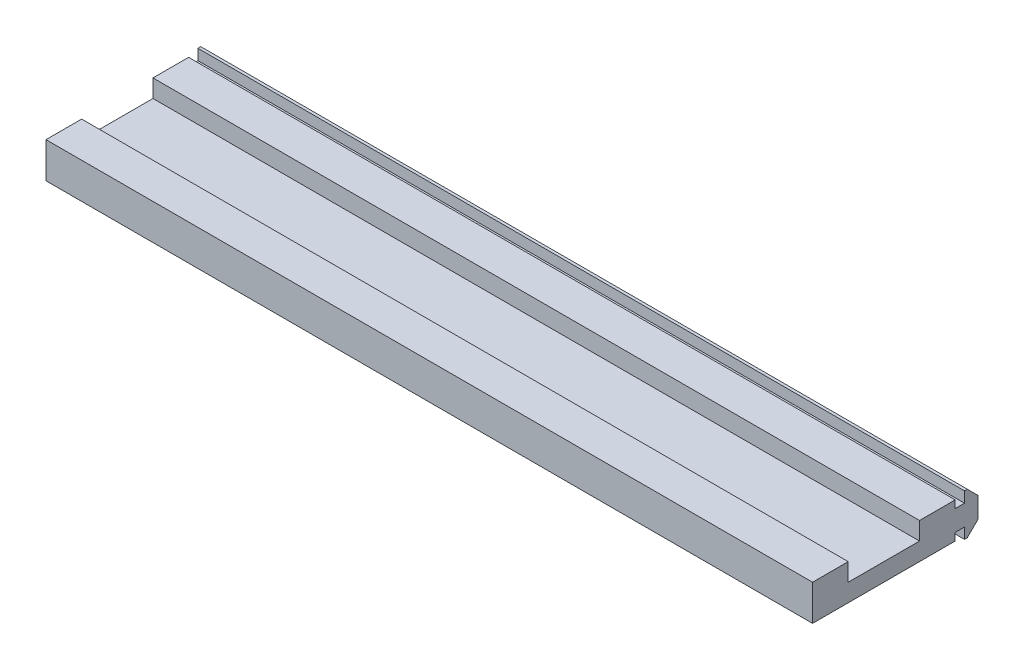
ISO-10303-21;
HEADER;
FILE_DESCRIPTION(('STEP AP214'),'2;1');
FILE_NAME('part.step','',(''),(''),'','','');
FILE_SCHEMA(('AUTOMOTIVE_DESIGN { 1 0 10303 214 1 1 1 1 }'));
ENDSEC;
DATA;
#1=APPLICATION_CONTEXT('core data for automotive mechanical design processes');
#2=APPLICATION_PROTOCOL_DEFINITION('international standard','automotive_design',2000,#1);
#3=PRODUCT_CONTEXT('',#1,'mechanical');
#4=PRODUCT('Part','Part','',(#3));
#5=PRODUCT_RELATED_PRODUCT_CATEGORY('part','',(#4));
#6=PRODUCT_DEFINITION_FORMATION('','',#4);
#7=PRODUCT_DEFINITION_CONTEXT('part definition',#1,'design');
#8=PRODUCT_DEFINITION('design','',#6,#7);
#9=PRODUCT_DEFINITION_SHAPE('','',#8);
#10=(LENGTH_UNIT() NAMED_UNIT(*) SI_UNIT(.MILLI.,.METRE.));
#11=(NAMED_UNIT(*) PLANE_ANGLE_UNIT() SI_UNIT($,.RADIAN.));
#12=(NAMED_UNIT(*) SI_UNIT($,.STERADIAN.) SOLID_ANGLE_UNIT());
#13=UNCERTAINTY_MEASURE_WITH_UNIT(LENGTH_MEASURE(1.E-05),#10,'distance_accuracy_value','');
#14=(GEOMETRIC_REPRESENTATION_CONTEXT(3) GLOBAL_UNCERTAINTY_ASSIGNED_CONTEXT((#13)) GLOBAL_UNIT_ASSIGNED_CONTEXT((#10,
#11,#12)) REPRESENTATION_CONTEXT('',''));
#15=CARTESIAN_POINT('',(0.,0.,0.));
#16=DIRECTION('',(0.,0.,1.));
#17=DIRECTION('',(1.,0.,0.));
#18=AXIS2_PLACEMENT_3D('',#15,#16,#17);
#19=CARTESIAN_POINT('',(495.,5.,0.));
#20=DIRECTION('',(0.,1.,0.));
#21=DIRECTION('',(0.,0.,1.));
#22=AXIS2_PLACEMENT_3D('',#19,#20,#21);
#23=PLANE('',#22);
#24=DIRECTION('',(-1.,0.,0.));
#25=VECTOR('',#24,1.);
#26=CARTESIAN_POINT('',(495.,5.,10.5));
#27=LINE('',#26,#25);
#28=CARTESIAN_POINT('',(495.,5.,10.5));
#29=VERTEX_POINT('',#28);
#30=CARTESIAN_POINT('',(280.,5.,10.5));
#31=VERTEX_POINT('',#30);
#32=EDGE_CURVE('E11',#29,#31,#27,.T.);
#33=ORIENTED_EDGE('',*,*,#32,.T.);
#34=DIRECTION('',(0.,0.,1.));
#35=VECTOR('',#34,1.);
#36=CARTESIAN_POINT('',(280.,5.,0.));
#37=LINE('',#36,#35);
#38=CARTESIAN_POINT('',(280.,5.,20.5));
#39=VERTEX_POINT('',#38);
#40=EDGE_CURVE('E252',#31,#39,#37,.T.);
#41=ORIENTED_EDGE('',*,*,#40,.T.);
#42=DIRECTION('',(-1.,0.,0.));
#43=VECTOR('',#42,1.);
#44=CARTESIAN_POINT('',(495.,5.,20.5));
#45=LINE('',#44,#43);
#46=CARTESIAN_POINT('',(495.,5.,20.5));
#47=VERTEX_POINT('',#46);
#48=EDGE_CURVE('E50',#47,#39,#45,.T.);
#49=ORIENTED_EDGE('',*,*,#48,.F.);
#50=DIRECTION('',(0.,0.,-1.));
#51=VECTOR('',#50,1.);
#52=CARTESIAN_POINT('',(495.,5.,0.));
#53=LINE('',#52,#51);
#54=EDGE_CURVE('E256',#47,#29,#53,.T.);
#55=ORIENTED_EDGE('',*,*,#54,.T.);
#56=EDGE_LOOP('',(#33,#41,#49,#55));
#57=FACE_BOUND('',#56,.T.);
#58=ADVANCED_FACE('F43',(#57),#23,.T.);
#59=CARTESIAN_POINT('',(495.,0.,20.5));
#60=DIRECTION('',(0.,0.,1.));
#61=DIRECTION('',(1.,0.,0.));
#62=AXIS2_PLACEMENT_3D('',#59,#60,#61);
#63=PLANE('',#62);
#64=ORIENTED_EDGE('',*,*,#48,.T.);
#65=DIRECTION('',(0.,-1.,0.));
#66=VECTOR('',#65,1.);
#67=CARTESIAN_POINT('',(280.,0.,20.5));
#68=LINE('',#67,#66);
#69=CARTESIAN_POINT('',(280.,0.,20.5));
#70=VERTEX_POINT('',#69);
#71=EDGE_CURVE('E249',#39,#70,#68,.T.);
#72=ORIENTED_EDGE('',*,*,#71,.T.);
#73=DIRECTION('',(-1.,0.,0.));
#74=VECTOR('',#73,1.);
#75=CARTESIAN_POINT('',(495.,0.,20.5));
#76=LINE('',#75,#74);
#77=CARTESIAN_POINT('',(495.,0.,20.5));
#78=VERTEX_POINT('',#77);
#79=EDGE_CURVE('E294',#78,#70,#76,.T.);
#80=ORIENTED_EDGE('',*,*,#79,.F.);
#81=DIRECTION('',(0.,1.,0.));
#82=VECTOR('',#81,1.);
#83=CARTESIAN_POINT('',(495.,0.,20.5));
#84=LINE('',#83,#82);
#85=EDGE_CURVE('E259',#78,#47,#84,.T.);
#86=ORIENTED_EDGE('',*,*,#85,.T.);
#87=EDGE_LOOP('',(#64,#72,#80,#86));
#88=FACE_BOUND('',#87,.T.);
#89=ADVANCED_FACE('F298',(#88),#63,.T.);
#90=CARTESIAN_POINT('',(495.,0.,0.));
#91=DIRECTION('',(0.,1.,0.));
#92=DIRECTION('',(0.,0.,1.));
#93=AXIS2_PLACEMENT_3D('',#90,#91,#92);
#94=PLANE('',#93);
#95=ORIENTED_EDGE('',*,*,#79,.T.);
#96=DIRECTION('',(0.,0.,1.));
#97=VECTOR('',#96,1.);
#98=CARTESIAN_POINT('',(280.,0.,0.));
#99=LINE('',#98,#97);
#100=CARTESIAN_POINT('',(280.,0.,40.5));
#101=VERTEX_POINT('',#100);
#102=EDGE_CURVE('E246',#70,#101,#99,.T.);
#103=ORIENTED_EDGE('',*,*,#102,.T.);
#104=DIRECTION('',(-1.,0.,0.));
#105=VECTOR('',#104,1.);
#106=CARTESIAN_POINT('',(495.,0.,40.5));
#107=LINE('',#106,#105);
#108=CARTESIAN_POINT('',(495.,0.,40.5));
#109=VERTEX_POINT('',#108);
#110=EDGE_CURVE('E291',#109,#101,#107,.T.);
#111=ORIENTED_EDGE('',*,*,#110,.F.);
#112=DIRECTION('',(0.,0.,-1.));
#113=VECTOR('',#112,1.);
#114=CARTESIAN_POINT('',(495.,0.,0.));
#115=LINE('',#114,#113);
#116=EDGE_CURVE('E262',#109,#78,#115,.T.);
#117=ORIENTED_EDGE('',*,*,#116,.T.);
#118=EDGE_LOOP('',(#95,#103,#111,#117));
#119=FACE_BOUND('',#118,.T.);
#120=ADVANCED_FACE('F312',(#119),#94,.T.);
#121=CARTESIAN_POINT('',(495.,0.,40.5));
#122=DIRECTION('',(0.,0.,-1.));
#123=DIRECTION('',(-1.,0.,0.));
#124=AXIS2_PLACEMENT_3D('',#121,#122,#123);
#125=PLANE('',#124);
#126=ORIENTED_EDGE('',*,*,#110,.T.);
#127=DIRECTION('',(0.,1.,0.));
#128=VECTOR('',#127,1.);
#129=CARTESIAN_POINT('',(280.,0.,40.5));
#130=LINE('',#129,#128);
#131=CARTESIAN_POINT('',(280.,4.99999999999999,40.5));
#132=VERTEX_POINT('',#131);
#133=EDGE_CURVE('E243',#101,#132,#130,.T.);
#134=ORIENTED_EDGE('',*,*,#133,.T.);
#135=DIRECTION('',(-1.,0.,0.));
#136=VECTOR('',#135,1.);
#137=CARTESIAN_POINT('',(495.,4.99999999999999,40.5));
#138=LINE('',#137,#136);
#139=CARTESIAN_POINT('',(495.,4.99999999999999,40.5));
#140=VERTEX_POINT('',#139);
#141=EDGE_CURVE('E288',#140,#132,#138,.T.);
#142=ORIENTED_EDGE('',*,*,#141,.F.);
#143=DIRECTION('',(0.,-1.,0.));
#144=VECTOR('',#143,1.);
#145=CARTESIAN_POINT('',(495.,0.,40.5));
#146=LINE('',#145,#144);
#147=EDGE_CURVE('E265',#140,#109,#146,.T.);
#148=ORIENTED_EDGE('',*,*,#147,.T.);
#149=EDGE_LOOP('',(#126,#134,#142,#148));
#150=FACE_BOUND('',#149,.T.);
#151=ADVANCED_FACE('F314',(#150),#125,.T.);
#152=CARTESIAN_POINT('',(495.,4.99999999999999,0.));
#153=DIRECTION('',(0.,1.,0.));
#154=DIRECTION('',(0.,0.,1.));
#155=AXIS2_PLACEMENT_3D('',#152,#153,#154);
#156=PLANE('',#155);
#157=ORIENTED_EDGE('',*,*,#141,.T.);
#158=DIRECTION('',(0.,0.,1.));
#159=VECTOR('',#158,1.);
#160=CARTESIAN_POINT('',(280.,4.99999999999999,0.));
#161=LINE('',#160,#159);
#162=CARTESIAN_POINT('',(280.,4.99999999999999,50.5));
#163=VERTEX_POINT('',#162);
#164=EDGE_CURVE('E240',#132,#163,#161,.T.);
#165=ORIENTED_EDGE('',*,*,#164,.T.);
#166=DIRECTION('',(-1.,0.,0.));
#167=VECTOR('',#166,1.);
#168=CARTESIAN_POINT('',(495.,4.99999999999999,50.5));
#169=LINE('',#168,#167);
#170=CARTESIAN_POINT('',(495.,4.99999999999999,50.5));
#171=VERTEX_POINT('',#170);
#172=EDGE_CURVE('E285',#171,#163,#169,.T.);
#173=ORIENTED_EDGE('',*,*,#172,.F.);
#174=DIRECTION('',(0.,0.,-1.));
#175=VECTOR('',#174,1.);
#176=CARTESIAN_POINT('',(495.,4.99999999999999,0.));
#177=LINE('',#176,#175);
#178=EDGE_CURVE('E268',#171,#140,#177,.T.);
#179=ORIENTED_EDGE('',*,*,#178,.T.);
#180=EDGE_LOOP('',(#157,#165,#173,#179));
#181=FACE_BOUND('',#180,.T.);
#182=ADVANCED_FACE('F319',(#181),#156,.T.);
#183=CARTESIAN_POINT('',(495.,0.,50.5));
#184=DIRECTION('',(0.,0.,1.));
#185=DIRECTION('',(1.,0.,0.));
#186=AXIS2_PLACEMENT_3D('',#183,#184,#185);
#187=PLANE('',#186);
#188=ORIENTED_EDGE('',*,*,#172,.T.);
#189=DIRECTION('',(0.,-1.,0.));
#190=VECTOR('',#189,1.);
#191=CARTESIAN_POINT('',(280.,0.,50.5));
#192=LINE('',#191,#190);
#193=CARTESIAN_POINT('',(280.,-5.00000000000001,50.5));
#194=VERTEX_POINT('',#193);
#195=EDGE_CURVE('E237',#163,#194,#192,.T.);
#196=ORIENTED_EDGE('',*,*,#195,.T.);
#197=DIRECTION('',(-1.,0.,0.));
#198=VECTOR('',#197,1.);
#199=CARTESIAN_POINT('',(495.,-5.00000000000001,50.5));
#200=LINE('',#199,#198);
#201=CARTESIAN_POINT('',(495.,-5.00000000000001,50.5));
#202=VERTEX_POINT('',#201);
#203=EDGE_CURVE('E282',#202,#194,#200,.T.);
#204=ORIENTED_EDGE('',*,*,#203,.F.);
#205=DIRECTION('',(0.,1.,0.));
#206=VECTOR('',#205,1.);
#207=CARTESIAN_POINT('',(495.,0.,50.5));
#208=LINE('',#207,#206);
#209=EDGE_CURVE('E271',#202,#171,#208,.T.);
#210=ORIENTED_EDGE('',*,*,#209,.T.);
#211=EDGE_LOOP('',(#188,#196,#204,#210));
#212=FACE_BOUND('',#211,.T.);
#213=ADVANCED_FACE('F321',(#212),#187,.T.);
#214=CARTESIAN_POINT('',(495.,-5.,0.));
#215=DIRECTION('',(0.,-1.,0.));
#216=DIRECTION('',(0.,0.,-1.));
#217=AXIS2_PLACEMENT_3D('',#214,#215,#216);
#218=PLANE('',#217);
#219=ORIENTED_EDGE('',*,*,#203,.T.);
#220=DIRECTION('',(0.,0.,-1.));
#221=VECTOR('',#220,1.);
#222=CARTESIAN_POINT('',(280.,-5.,0.));
#223=LINE('',#222,#221);
#224=CARTESIAN_POINT('',(280.,-5.,10.5));
#225=VERTEX_POINT('',#224);
#226=EDGE_CURVE('E234',#194,#225,#223,.T.);
#227=ORIENTED_EDGE('',*,*,#226,.T.);
#228=DIRECTION('',(-1.,0.,0.));
#229=VECTOR('',#228,1.);
#230=CARTESIAN_POINT('',(495.,-5.,10.5));
#231=LINE('',#230,#229);
#232=CARTESIAN_POINT('',(495.,-5.,10.5));
#233=VERTEX_POINT('',#232);
#234=EDGE_CURVE('E279',#233,#225,#231,.T.);
#235=ORIENTED_EDGE('',*,*,#234,.F.);
#236=DIRECTION('',(0.,0.,1.));
#237=VECTOR('',#236,1.);
#238=CARTESIAN_POINT('',(495.,-5.,0.));
#239=LINE('',#238,#237);
#240=EDGE_CURVE('E274',#233,#202,#239,.T.);
#241=ORIENTED_EDGE('',*,*,#240,.T.);
#242=EDGE_LOOP('',(#219,#227,#235,#241));
#243=FACE_BOUND('',#242,.T.);
#244=ADVANCED_FACE('F325',(#243),#218,.T.);
#245=CARTESIAN_POINT('',(495.,0.,10.5));
#246=DIRECTION('',(0.,0.,-1.));
#247=DIRECTION('',(-1.,0.,0.));
#248=AXIS2_PLACEMENT_3D('',#245,#246,#247);
#249=PLANE('',#248);
#250=DIRECTION('',(-1.,0.,0.));
#251=VECTOR('',#250,1.);
#252=CARTESIAN_POINT('',(495.,-2.9,10.5));
#253=LINE('',#252,#251);
#254=CARTESIAN_POINT('',(495.,-2.9,10.5));
#255=VERTEX_POINT('',#254);
#256=CARTESIAN_POINT('',(280.,-2.9,10.5));
#257=VERTEX_POINT('',#256);
#258=EDGE_CURVE('E57',#255,#257,#253,.T.);
#259=ORIENTED_EDGE('',*,*,#258,.F.);
#260=DIRECTION('',(0.,-1.,0.));
#261=VECTOR('',#260,1.);
#262=CARTESIAN_POINT('',(495.,0.,10.5));
#263=LINE('',#262,#261);
#264=EDGE_CURVE('E277',#255,#233,#263,.T.);
#265=ORIENTED_EDGE('',*,*,#264,.T.);
#266=ORIENTED_EDGE('',*,*,#234,.T.);
#267=DIRECTION('',(0.,1.,0.));
#268=VECTOR('',#267,1.);
#269=CARTESIAN_POINT('',(280.,0.,10.5));
#270=LINE('',#269,#268);
#271=EDGE_CURVE('E233',#225,#257,#270,.T.);
#272=ORIENTED_EDGE('',*,*,#271,.T.);
#273=EDGE_LOOP('',(#259,#265,#266,#272));
#274=FACE_BOUND('',#273,.T.);
#275=ADVANCED_FACE('F326',(#274),#249,.T.);
#276=DIRECTION('',(1.,0.,0.));
#277=VECTOR('',#276,1.);
#278=CARTESIAN_POINT('',(495.,2.9,10.5));
#279=LINE('',#278,#277);
#280=CARTESIAN_POINT('',(280.,2.9,10.5));
#281=VERTEX_POINT('',#280);
#282=CARTESIAN_POINT('',(495.,2.9,10.5));
#283=VERTEX_POINT('',#282);
#284=EDGE_CURVE('E228',#281,#283,#279,.T.);
#285=ORIENTED_EDGE('',*,*,#284,.F.);
#286=EDGE_CURVE('E231',#281,#31,#270,.T.);
#287=ORIENTED_EDGE('',*,*,#286,.T.);
#288=ORIENTED_EDGE('',*,*,#32,.F.);
#289=DIRECTION('',(0.,-1.,0.));
#290=VECTOR('',#289,1.);
#291=CARTESIAN_POINT('',(495.,0.,10.5));
#292=LINE('',#291,#290);
#293=EDGE_CURVE('E65',#29,#283,#292,.T.);
#294=ORIENTED_EDGE('',*,*,#293,.T.);
#295=EDGE_LOOP('',(#285,#287,#288,#294));
#296=FACE_BOUND('',#295,.T.);
#297=ADVANCED_FACE('F308',(#296),#249,.T.);
#298=CARTESIAN_POINT('',(495.,0.,0.));
#299=DIRECTION('',(1.,0.,0.));
#300=DIRECTION('',(0.,0.,-1.));
#301=AXIS2_PLACEMENT_3D('',#298,#299,#300);
#302=PLANE('',#301);
#303=ORIENTED_EDGE('',*,*,#264,.F.);
#304=DIRECTION('',(0.,0.,1.));
#305=VECTOR('',#304,1.);
#306=CARTESIAN_POINT('',(495.,-2.9,7.89999999999999));
#307=LINE('',#306,#305);
#308=CARTESIAN_POINT('',(495.,-2.9,7.89999999999999));
#309=VERTEX_POINT('',#308);
#310=EDGE_CURVE('E201',#309,#255,#307,.T.);
#311=ORIENTED_EDGE('',*,*,#310,.F.);
#312=DIRECTION('',(0.,1.,0.));
#313=VECTOR('',#312,1.);
#314=CARTESIAN_POINT('',(495.,-5.9,7.89999999999999));
#315=LINE('',#314,#313);
#316=CARTESIAN_POINT('',(495.,-5.9,7.89999999999999));
#317=VERTEX_POINT('',#316);
#318=EDGE_CURVE('E204',#317,#309,#315,.T.);
#319=ORIENTED_EDGE('',*,*,#318,.F.);
#320=DIRECTION('',(0.,0.,1.));
#321=VECTOR('',#320,1.);
#322=CARTESIAN_POINT('',(495.,-5.9,7.10208152801713));
#323=LINE('',#322,#321);
#324=CARTESIAN_POINT('',(495.,-5.9,7.10208152801713));
#325=VERTEX_POINT('',#324);
#326=EDGE_CURVE('E208',#325,#317,#323,.T.);
#327=ORIENTED_EDGE('',*,*,#326,.F.);
#328=DIRECTION('',(0.,-0.707106781186548,0.707106781186548));
#329=VECTOR('',#328,1.);
#330=CARTESIAN_POINT('',(495.,-2.89791847198287,4.1));
#331=LINE('',#330,#329);
#332=CARTESIAN_POINT('',(495.,-2.89791847198287,4.1));
#333=VERTEX_POINT('',#332);
#334=EDGE_CURVE('E212',#333,#325,#331,.T.);
#335=ORIENTED_EDGE('',*,*,#334,.F.);
#336=DIRECTION('',(0.,-1.,0.));
#337=VECTOR('',#336,1.);
#338=CARTESIAN_POINT('',(495.,2.89791847198287,4.1));
#339=LINE('',#338,#337);
#340=CARTESIAN_POINT('',(495.,2.89791847198287,4.1));
#341=VERTEX_POINT('',#340);
#342=EDGE_CURVE('E216',#341,#333,#339,.T.);
#343=ORIENTED_EDGE('',*,*,#342,.F.);
#344=DIRECTION('',(0.,-0.707106781186548,-0.707106781186548));
#345=VECTOR('',#344,1.);
#346=CARTESIAN_POINT('',(495.,5.9,7.10208152801713));
#347=LINE('',#346,#345);
#348=CARTESIAN_POINT('',(495.,5.9,7.10208152801713));
#349=VERTEX_POINT('',#348);
#350=EDGE_CURVE('E175',#349,#341,#347,.T.);
#351=ORIENTED_EDGE('',*,*,#350,.F.);
#352=DIRECTION('',(0.,0.,-1.));
#353=VECTOR('',#352,1.);
#354=CARTESIAN_POINT('',(495.,5.9,7.9));
#355=LINE('',#354,#353);
#356=CARTESIAN_POINT('',(495.,5.9,7.9));
#357=VERTEX_POINT('',#356);
#358=EDGE_CURVE('E167',#357,#349,#355,.T.);
#359=ORIENTED_EDGE('',*,*,#358,.F.);
#360=DIRECTION('',(0.,1.,0.));
#361=VECTOR('',#360,1.);
#362=CARTESIAN_POINT('',(495.,2.9,7.9));
#363=LINE('',#362,#361);
#364=CARTESIAN_POINT('',(495.,2.9,7.9));
#365=VERTEX_POINT('',#364);
#366=EDGE_CURVE('E172',#365,#357,#363,.T.);
#367=ORIENTED_EDGE('',*,*,#366,.F.);
#368=DIRECTION('',(0.,0.,-1.));
#369=VECTOR('',#368,1.);
#370=CARTESIAN_POINT('',(495.,2.9,10.7));
#371=LINE('',#370,#369);
#372=EDGE_CURVE('E199',#283,#365,#371,.T.);
#373=ORIENTED_EDGE('',*,*,#372,.F.);
#374=ORIENTED_EDGE('',*,*,#293,.F.);
#375=ORIENTED_EDGE('',*,*,#54,.F.);
#376=ORIENTED_EDGE('',*,*,#85,.F.);
#377=ORIENTED_EDGE('',*,*,#116,.F.);
#378=ORIENTED_EDGE('',*,*,#147,.F.);
#379=ORIENTED_EDGE('',*,*,#178,.F.);
#380=ORIENTED_EDGE('',*,*,#209,.F.);
#381=ORIENTED_EDGE('',*,*,#240,.F.);
#382=EDGE_LOOP('',(#303,#311,#319,#327,#335,#343,#351,#359,#367,#373,#374,#375,#376,#377,#378,
#379,#380,#381));
#383=FACE_BOUND('',#382,.T.);
#384=ADVANCED_FACE('F169',(#383),#302,.T.);
#385=CARTESIAN_POINT('',(280.,0.,0.));
#386=DIRECTION('',(-1.,0.,0.));
#387=DIRECTION('',(0.,0.,1.));
#388=AXIS2_PLACEMENT_3D('',#385,#386,#387);
#389=PLANE('',#388);
#390=ORIENTED_EDGE('',*,*,#286,.F.);
#391=DIRECTION('',(0.,0.,-1.));
#392=VECTOR('',#391,1.);
#393=CARTESIAN_POINT('',(280.,2.9,10.7));
#394=LINE('',#393,#392);
#395=CARTESIAN_POINT('',(280.,2.9,7.9));
#396=VERTEX_POINT('',#395);
#397=EDGE_CURVE('E189',#281,#396,#394,.T.);
#398=ORIENTED_EDGE('',*,*,#397,.T.);
#399=DIRECTION('',(0.,1.,0.));
#400=VECTOR('',#399,1.);
#401=CARTESIAN_POINT('',(280.,2.9,7.9));
#402=LINE('',#401,#400);
#403=CARTESIAN_POINT('',(280.,5.9,7.9));
#404=VERTEX_POINT('',#403);
#405=EDGE_CURVE('E361',#396,#404,#402,.T.);
#406=ORIENTED_EDGE('',*,*,#405,.T.);
#407=DIRECTION('',(0.,0.,-1.));
#408=VECTOR('',#407,1.);
#409=CARTESIAN_POINT('',(280.,5.9,7.9));
#410=LINE('',#409,#408);
#411=CARTESIAN_POINT('',(280.,5.9,7.10208152801713));
#412=VERTEX_POINT('',#411);
#413=EDGE_CURVE('E185',#404,#412,#410,.T.);
#414=ORIENTED_EDGE('',*,*,#413,.T.);
#415=DIRECTION('',(0.,-0.707106781186548,-0.707106781186548));
#416=VECTOR('',#415,1.);
#417=CARTESIAN_POINT('',(280.,5.9,7.10208152801713));
#418=LINE('',#417,#416);
#419=CARTESIAN_POINT('',(280.,2.89791847198287,4.1));
#420=VERTEX_POINT('',#419);
#421=EDGE_CURVE('E359',#412,#420,#418,.T.);
#422=ORIENTED_EDGE('',*,*,#421,.T.);
#423=DIRECTION('',(0.,-1.,0.));
#424=VECTOR('',#423,1.);
#425=CARTESIAN_POINT('',(280.,2.89791847198287,4.1));
#426=LINE('',#425,#424);
#427=CARTESIAN_POINT('',(280.,-2.89791847198287,4.1));
#428=VERTEX_POINT('',#427);
#429=EDGE_CURVE('E354',#420,#428,#426,.T.);
#430=ORIENTED_EDGE('',*,*,#429,.T.);
#431=DIRECTION('',(0.,-0.707106781186547,0.707106781186547));
#432=VECTOR('',#431,1.);
#433=CARTESIAN_POINT('',(280.,-2.89791847198287,4.1));
#434=LINE('',#433,#432);
#435=CARTESIAN_POINT('',(280.,-5.9,7.10208152801713));
#436=VERTEX_POINT('',#435);
#437=EDGE_CURVE('E348',#428,#436,#434,.T.);
#438=ORIENTED_EDGE('',*,*,#437,.T.);
#439=DIRECTION('',(0.,0.,1.));
#440=VECTOR('',#439,1.);
#441=CARTESIAN_POINT('',(280.,-5.9,7.10208152801713));
#442=LINE('',#441,#440);
#443=CARTESIAN_POINT('',(280.,-5.9,7.89999999999999));
#444=VERTEX_POINT('',#443);
#445=EDGE_CURVE('E343',#436,#444,#442,.T.);
#446=ORIENTED_EDGE('',*,*,#445,.T.);
#447=DIRECTION('',(0.,1.,0.));
#448=VECTOR('',#447,1.);
#449=CARTESIAN_POINT('',(280.,-5.9,7.89999999999999));
#450=LINE('',#449,#448);
#451=CARTESIAN_POINT('',(280.,-2.9,7.89999999999999));
#452=VERTEX_POINT('',#451);
#453=EDGE_CURVE('E367',#444,#452,#450,.T.);
#454=ORIENTED_EDGE('',*,*,#453,.T.);
#455=DIRECTION('',(0.,0.,1.));
#456=VECTOR('',#455,1.);
#457=CARTESIAN_POINT('',(280.,-2.9,7.89999999999999));
#458=LINE('',#457,#456);
#459=EDGE_CURVE('E229',#452,#257,#458,.T.);
#460=ORIENTED_EDGE('',*,*,#459,.T.);
#461=ORIENTED_EDGE('',*,*,#271,.F.);
#462=ORIENTED_EDGE('',*,*,#226,.F.);
#463=ORIENTED_EDGE('',*,*,#195,.F.);
#464=ORIENTED_EDGE('',*,*,#164,.F.);
#465=ORIENTED_EDGE('',*,*,#133,.F.);
#466=ORIENTED_EDGE('',*,*,#102,.F.);
#467=ORIENTED_EDGE('',*,*,#71,.F.);
#468=ORIENTED_EDGE('',*,*,#40,.F.);
#469=EDGE_LOOP('',(#390,#398,#406,#414,#422,#430,#438,#446,#454,#460,#461,#462,#463,#464,#465,
#466,#467,#468));
#470=FACE_BOUND('',#469,.T.);
#471=ADVANCED_FACE('F310',(#470),#389,.T.);
#472=CARTESIAN_POINT('',(508.520355024924,2.9,10.7));
#473=DIRECTION('',(0.,1.,0.));
#474=DIRECTION('',(0.,0.,1.));
#475=AXIS2_PLACEMENT_3D('',#472,#473,#474);
#476=PLANE('',#475);
#477=ORIENTED_EDGE('',*,*,#397,.F.);
#478=ORIENTED_EDGE('',*,*,#284,.T.);
#479=ORIENTED_EDGE('',*,*,#372,.T.);
#480=DIRECTION('',(-1.,0.,0.));
#481=VECTOR('',#480,1.);
#482=CARTESIAN_POINT('',(508.520355024924,2.9,7.9));
#483=LINE('',#482,#481);
#484=EDGE_CURVE('E193',#365,#396,#483,.T.);
#485=ORIENTED_EDGE('',*,*,#484,.T.);
#486=EDGE_LOOP('',(#477,#478,#479,#485));
#487=FACE_BOUND('',#486,.T.);
#488=ADVANCED_FACE('F306',(#487),#476,.T.);
#489=CARTESIAN_POINT('',(508.520355024924,-2.9,7.89999999999999));
#490=DIRECTION('',(0.,-1.,0.));
#491=DIRECTION('',(0.,0.,-1.));
#492=AXIS2_PLACEMENT_3D('',#489,#490,#491);
#493=PLANE('',#492);
#494=ORIENTED_EDGE('',*,*,#310,.T.);
#495=ORIENTED_EDGE('',*,*,#258,.T.);
#496=ORIENTED_EDGE('',*,*,#459,.F.);
#497=DIRECTION('',(-1.,0.,0.));
#498=VECTOR('',#497,1.);
#499=CARTESIAN_POINT('',(508.520355024924,-2.9,7.89999999999999));
#500=LINE('',#499,#498);
#501=EDGE_CURVE('E207',#309,#452,#500,.T.);
#502=ORIENTED_EDGE('',*,*,#501,.F.);
#503=EDGE_LOOP('',(#494,#495,#496,#502));
#504=FACE_BOUND('',#503,.T.);
#505=ADVANCED_FACE('F329',(#504),#493,.T.);
#506=CARTESIAN_POINT('',(508.520355024924,-5.9,7.89999999999999));
#507=DIRECTION('',(0.,0.,1.));
#508=DIRECTION('',(1.,0.,0.));
#509=AXIS2_PLACEMENT_3D('',#506,#507,#508);
#510=PLANE('',#509);
#511=DIRECTION('',(-1.,0.,0.));
#512=VECTOR('',#511,1.);
#513=CARTESIAN_POINT('',(508.520355024924,-5.9,7.89999999999999));
#514=LINE('',#513,#512);
#515=EDGE_CURVE('E211',#317,#444,#514,.T.);
#516=ORIENTED_EDGE('',*,*,#515,.F.);
#517=ORIENTED_EDGE('',*,*,#318,.T.);
#518=ORIENTED_EDGE('',*,*,#501,.T.);
#519=ORIENTED_EDGE('',*,*,#453,.F.);
#520=EDGE_LOOP('',(#516,#517,#518,#519));
#521=FACE_BOUND('',#520,.T.);
#522=ADVANCED_FACE('F336',(#521),#510,.T.);
#523=CARTESIAN_POINT('',(508.520355024924,-5.9,7.10208152801713));
#524=DIRECTION('',(0.,-1.,0.));
#525=DIRECTION('',(0.,0.,-1.));
#526=AXIS2_PLACEMENT_3D('',#523,#524,#525);
#527=PLANE('',#526);
#528=DIRECTION('',(-1.,0.,0.));
#529=VECTOR('',#528,1.);
#530=CARTESIAN_POINT('',(508.520355024924,-5.9,7.10208152801713));
#531=LINE('',#530,#529);
#532=EDGE_CURVE('E215',#325,#436,#531,.T.);
#533=ORIENTED_EDGE('',*,*,#532,.F.);
#534=ORIENTED_EDGE('',*,*,#326,.T.);
#535=ORIENTED_EDGE('',*,*,#515,.T.);
#536=ORIENTED_EDGE('',*,*,#445,.F.);
#537=EDGE_LOOP('',(#533,#534,#535,#536));
#538=FACE_BOUND('',#537,.T.);
#539=ADVANCED_FACE('F341',(#538),#527,.T.);
#540=CARTESIAN_POINT('',(508.520355024924,-2.89791847198287,4.1));
#541=DIRECTION('',(0.,-0.707106781186548,-0.707106781186548));
#542=DIRECTION('',(0.,0.707106781186548,-0.707106781186548));
#543=AXIS2_PLACEMENT_3D('',#540,#541,#542);
#544=PLANE('',#543);
#545=DIRECTION('',(-1.,0.,0.));
#546=VECTOR('',#545,1.);
#547=CARTESIAN_POINT('',(508.520355024924,-2.89791847198287,4.1));
#548=LINE('',#547,#546);
#549=EDGE_CURVE('E219',#333,#428,#548,.T.);
#550=ORIENTED_EDGE('',*,*,#549,.F.);
#551=ORIENTED_EDGE('',*,*,#334,.T.);
#552=ORIENTED_EDGE('',*,*,#532,.T.);
#553=ORIENTED_EDGE('',*,*,#437,.F.);
#554=EDGE_LOOP('',(#550,#551,#552,#553));
#555=FACE_BOUND('',#554,.T.);
#556=ADVANCED_FACE('F347',(#555),#544,.T.);
#557=CARTESIAN_POINT('',(508.520355024924,2.89791847198287,4.1));
#558=DIRECTION('',(0.,0.,-1.));
#559=DIRECTION('',(-1.,0.,0.));
#560=AXIS2_PLACEMENT_3D('',#557,#558,#559);
#561=PLANE('',#560);
#562=DIRECTION('',(-1.,0.,0.));
#563=VECTOR('',#562,1.);
#564=CARTESIAN_POINT('',(508.520355024924,2.89791847198287,4.1));
#565=LINE('',#564,#563);
#566=EDGE_CURVE('E179',#341,#420,#565,.T.);
#567=ORIENTED_EDGE('',*,*,#566,.F.);
#568=ORIENTED_EDGE('',*,*,#342,.T.);
#569=ORIENTED_EDGE('',*,*,#549,.T.);
#570=ORIENTED_EDGE('',*,*,#429,.F.);
#571=EDGE_LOOP('',(#567,#568,#569,#570));
#572=FACE_BOUND('',#571,.T.);
#573=ADVANCED_FACE('F353',(#572),#561,.T.);
#574=CARTESIAN_POINT('',(508.520355024924,5.9,7.10208152801713));
#575=DIRECTION('',(0.,0.707106781186548,-0.707106781186548));
#576=DIRECTION('',(0.,0.707106781186548,0.707106781186548));
#577=AXIS2_PLACEMENT_3D('',#574,#575,#576);
#578=PLANE('',#577);
#579=DIRECTION('',(-1.,0.,0.));
#580=VECTOR('',#579,1.);
#581=CARTESIAN_POINT('',(508.520355024924,5.9,7.10208152801713));
#582=LINE('',#581,#580);
#583=EDGE_CURVE('E178',#349,#412,#582,.T.);
#584=ORIENTED_EDGE('',*,*,#583,.F.);
#585=ORIENTED_EDGE('',*,*,#350,.T.);
#586=ORIENTED_EDGE('',*,*,#566,.T.);
#587=ORIENTED_EDGE('',*,*,#421,.F.);
#588=EDGE_LOOP('',(#584,#585,#586,#587));
#589=FACE_BOUND('',#588,.T.);
#590=ADVANCED_FACE('F358',(#589),#578,.T.);
#591=CARTESIAN_POINT('',(508.520355024924,5.9,7.9));
#592=DIRECTION('',(0.,1.,0.));
#593=DIRECTION('',(0.,0.,1.));
#594=AXIS2_PLACEMENT_3D('',#591,#592,#593);
#595=PLANE('',#594);
#596=DIRECTION('',(-1.,0.,0.));
#597=VECTOR('',#596,1.);
#598=CARTESIAN_POINT('',(508.520355024924,5.9,7.9));
#599=LINE('',#598,#597);
#600=EDGE_CURVE('E182',#357,#404,#599,.T.);
#601=ORIENTED_EDGE('',*,*,#600,.F.);
#602=ORIENTED_EDGE('',*,*,#358,.T.);
#603=ORIENTED_EDGE('',*,*,#583,.T.);
#604=ORIENTED_EDGE('',*,*,#413,.F.);
#605=EDGE_LOOP('',(#601,#602,#603,#604));
#606=FACE_BOUND('',#605,.T.);
#607=ADVANCED_FACE('F183',(#606),#595,.T.);
#608=CARTESIAN_POINT('',(508.520355024924,2.9,7.9));
#609=DIRECTION('',(0.,0.,1.));
#610=DIRECTION('',(1.,0.,0.));
#611=AXIS2_PLACEMENT_3D('',#608,#609,#610);
#612=PLANE('',#611);
#613=ORIENTED_EDGE('',*,*,#484,.F.);
#614=ORIENTED_EDGE('',*,*,#366,.T.);
#615=ORIENTED_EDGE('',*,*,#600,.T.);
#616=ORIENTED_EDGE('',*,*,#405,.F.);
#617=EDGE_LOOP('',(#613,#614,#615,#616));
#618=FACE_BOUND('',#617,.T.);
#619=ADVANCED_FACE('F191',(#618),#612,.T.);
#620=CLOSED_SHELL('',(#58,#89,#120,#151,#182,#213,#244,#275,#297,#384,#471,#488,#505,#522,#539,
#556,#573,#590,#607,#619));
#621=MANIFOLD_SOLID_BREP('B2',#620);
#622=ADVANCED_BREP_SHAPE_REPRESENTATION('',(#18,#621),#14);
#623=SHAPE_DEFINITION_REPRESENTATION(#9,#622);
ENDSEC;
END-ISO-10303-21;
